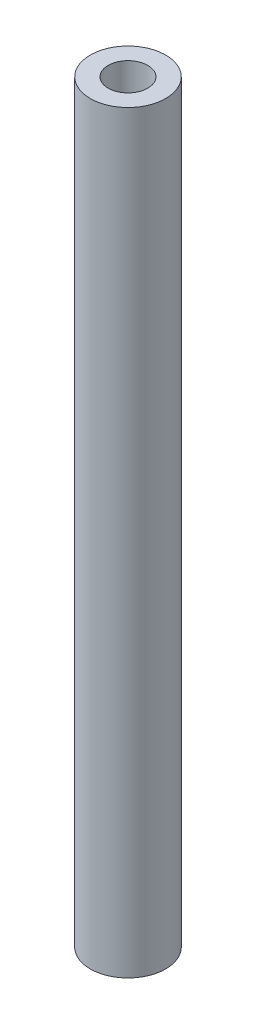
ISO-10303-21;
HEADER;
FILE_DESCRIPTION(('STEP AP214'),'2;1');
FILE_NAME('part.step','',(''),(''),'','','');
FILE_SCHEMA(('AUTOMOTIVE_DESIGN { 1 0 10303 214 1 1 1 1 }'));
ENDSEC;
DATA;
#1=APPLICATION_CONTEXT('core data for automotive mechanical design processes');
#2=APPLICATION_PROTOCOL_DEFINITION('international standard','automotive_design',2000,#1);
#3=PRODUCT_CONTEXT('',#1,'mechanical');
#4=PRODUCT('Part','Part','',(#3));
#5=PRODUCT_RELATED_PRODUCT_CATEGORY('part','',(#4));
#6=PRODUCT_DEFINITION_FORMATION('','',#4);
#7=PRODUCT_DEFINITION_CONTEXT('part definition',#1,'design');
#8=PRODUCT_DEFINITION('design','',#6,#7);
#9=PRODUCT_DEFINITION_SHAPE('','',#8);
#10=(LENGTH_UNIT() NAMED_UNIT(*) SI_UNIT(.MILLI.,.METRE.));
#11=(NAMED_UNIT(*) PLANE_ANGLE_UNIT() SI_UNIT($,.RADIAN.));
#12=(NAMED_UNIT(*) SI_UNIT($,.STERADIAN.) SOLID_ANGLE_UNIT());
#13=UNCERTAINTY_MEASURE_WITH_UNIT(LENGTH_MEASURE(1.E-05),#10,'distance_accuracy_value','');
#14=(GEOMETRIC_REPRESENTATION_CONTEXT(3) GLOBAL_UNCERTAINTY_ASSIGNED_CONTEXT((#13)) GLOBAL_UNIT_ASSIGNED_CONTEXT((#10,
#11,#12)) REPRESENTATION_CONTEXT('',''));
#15=CARTESIAN_POINT('',(0.,0.,0.));
#16=DIRECTION('',(0.,0.,1.));
#17=DIRECTION('',(1.,0.,0.));
#18=AXIS2_PLACEMENT_3D('',#15,#16,#17);
#19=CARTESIAN_POINT('',(0.,-0.0001,0.));
#20=DIRECTION('',(0.,1.,0.));
#21=DIRECTION('',(0.,0.,1.));
#22=AXIS2_PLACEMENT_3D('',#19,#20,#21);
#23=CYLINDRICAL_SURFACE('',#22,4.);
#24=CARTESIAN_POINT('',(0.,-0.0001,0.));
#25=DIRECTION('',(0.,1.,0.));
#26=DIRECTION('',(0.,0.,1.));
#27=AXIS2_PLACEMENT_3D('',#24,#25,#26);
#28=CIRCLE('',#27,4.);
#29=CARTESIAN_POINT('',(0.,-0.0001,4.));
#30=VERTEX_POINT('',#29);
#31=EDGE_CURVE('E11',#30,#30,#28,.T.);
#32=ORIENTED_EDGE('',*,*,#31,.T.);
#33=EDGE_LOOP('',(#32));
#34=FACE_BOUND('',#33,.T.);
#35=CARTESIAN_POINT('',(0.,80.,0.));
#36=DIRECTION('',(0.,1.,0.));
#37=DIRECTION('',(0.,0.,1.));
#38=AXIS2_PLACEMENT_3D('',#35,#36,#37);
#39=CIRCLE('',#38,4.);
#40=CARTESIAN_POINT('',(0.,80.,4.));
#41=VERTEX_POINT('',#40);
#42=EDGE_CURVE('E45',#41,#41,#39,.T.);
#43=ORIENTED_EDGE('',*,*,#42,.F.);
#44=EDGE_LOOP('',(#43));
#45=FACE_BOUND('',#44,.T.);
#46=ADVANCED_FACE('F38',(#34,#45),#23,.T.);
#47=CARTESIAN_POINT('',(0.,-0.0001,0.));
#48=DIRECTION('',(0.,1.,0.));
#49=DIRECTION('',(0.,0.,1.));
#50=AXIS2_PLACEMENT_3D('',#47,#48,#49);
#51=PLANE('',#50);
#52=CARTESIAN_POINT('',(0.,-9.99999999999449E-05,0.));
#53=DIRECTION('',(0.,-1.,0.));
#54=DIRECTION('',(0.,0.,-1.));
#55=AXIS2_PLACEMENT_3D('',#52,#53,#54);
#56=CIRCLE('',#55,2.1);
#57=CARTESIAN_POINT('',(0.,-9.99999999999449E-05,-2.1));
#58=VERTEX_POINT('',#57);
#59=EDGE_CURVE('E62',#58,#58,#56,.T.);
#60=ORIENTED_EDGE('',*,*,#59,.F.);
#61=EDGE_LOOP('',(#60));
#62=FACE_BOUND('',#61,.T.);
#63=ORIENTED_EDGE('',*,*,#31,.F.);
#64=EDGE_LOOP('',(#63));
#65=FACE_BOUND('',#64,.T.);
#66=ADVANCED_FACE('F77',(#62,#65),#51,.F.);
#67=CARTESIAN_POINT('',(0.,80.,0.));
#68=DIRECTION('',(0.,1.,0.));
#69=DIRECTION('',(0.,0.,1.));
#70=AXIS2_PLACEMENT_3D('',#67,#68,#69);
#71=PLANE('',#70);
#72=CARTESIAN_POINT('',(0.,80.,0.));
#73=DIRECTION('',(0.,1.,0.));
#74=DIRECTION('',(0.,0.,1.));
#75=AXIS2_PLACEMENT_3D('',#72,#73,#74);
#76=CIRCLE('',#75,2.1);
#77=CARTESIAN_POINT('',(0.,80.,2.1));
#78=VERTEX_POINT('',#77);
#79=EDGE_CURVE('E61',#78,#78,#76,.T.);
#80=ORIENTED_EDGE('',*,*,#79,.F.);
#81=EDGE_LOOP('',(#80));
#82=FACE_BOUND('',#81,.T.);
#83=ORIENTED_EDGE('',*,*,#42,.T.);
#84=EDGE_LOOP('',(#83));
#85=FACE_BOUND('',#84,.T.);
#86=ADVANCED_FACE('F74',(#82,#85),#71,.T.);
#87=CARTESIAN_POINT('',(0.,66.,0.));
#88=DIRECTION('',(0.,1.,0.));
#89=DIRECTION('',(0.,0.,1.));
#90=AXIS2_PLACEMENT_3D('',#87,#88,#89);
#91=CONICAL_SURFACE('',#90,2.1,1.02974425867665);
#92=CARTESIAN_POINT('',(0.,64.7381927000421,0.));
#93=VERTEX_POINT('',#92);
#94=VERTEX_LOOP('',#93);
#95=FACE_BOUND('',#94,.T.);
#96=CARTESIAN_POINT('',(0.,66.,0.));
#97=DIRECTION('',(0.,1.,0.));
#98=DIRECTION('',(0.,0.,1.));
#99=AXIS2_PLACEMENT_3D('',#96,#97,#98);
#100=CIRCLE('',#99,2.1);
#101=CARTESIAN_POINT('',(0.,66.,2.1));
#102=VERTEX_POINT('',#101);
#103=EDGE_CURVE('E65',#102,#102,#100,.T.);
#104=ORIENTED_EDGE('',*,*,#103,.T.);
#105=EDGE_LOOP('',(#104));
#106=FACE_BOUND('',#105,.T.);
#107=ADVANCED_FACE('F88',(#95,#106),#91,.F.);
#108=CARTESIAN_POINT('',(0.,80.,0.));
#109=DIRECTION('',(0.,1.,0.));
#110=DIRECTION('',(0.,0.,1.));
#111=AXIS2_PLACEMENT_3D('',#108,#109,#110);
#112=CYLINDRICAL_SURFACE('',#111,2.1);
#113=ORIENTED_EDGE('',*,*,#103,.F.);
#114=EDGE_LOOP('',(#113));
#115=FACE_BOUND('',#114,.T.);
#116=ORIENTED_EDGE('',*,*,#79,.T.);
#117=EDGE_LOOP('',(#116));
#118=FACE_BOUND('',#117,.T.);
#119=ADVANCED_FACE('F55',(#115,#118),#112,.F.);
#120=CARTESIAN_POINT('',(0.,13.9999,0.));
#121=DIRECTION('',(0.,-1.,0.));
#122=DIRECTION('',(0.,0.,-1.));
#123=AXIS2_PLACEMENT_3D('',#120,#121,#122);
#124=CONICAL_SURFACE('',#123,2.1,1.02974425867665);
#125=CARTESIAN_POINT('',(0.,15.2617072999579,0.));
#126=VERTEX_POINT('',#125);
#127=VERTEX_LOOP('',#126);
#128=FACE_BOUND('',#127,.T.);
#129=CARTESIAN_POINT('',(0.,13.9999,0.));
#130=DIRECTION('',(0.,-1.,0.));
#131=DIRECTION('',(0.,0.,-1.));
#132=AXIS2_PLACEMENT_3D('',#129,#130,#131);
#133=CIRCLE('',#132,2.1);
#134=CARTESIAN_POINT('',(0.,13.9999,-2.1));
#135=VERTEX_POINT('',#134);
#136=EDGE_CURVE('E59',#135,#135,#133,.T.);
#137=ORIENTED_EDGE('',*,*,#136,.T.);
#138=EDGE_LOOP('',(#137));
#139=FACE_BOUND('',#138,.T.);
#140=ADVANCED_FACE('F51',(#128,#139),#124,.F.);
#141=CARTESIAN_POINT('',(0.,-0.0001,0.));
#142=DIRECTION('',(0.,-1.,0.));
#143=DIRECTION('',(0.,0.,-1.));
#144=AXIS2_PLACEMENT_3D('',#141,#142,#143);
#145=CYLINDRICAL_SURFACE('',#144,2.1);
#146=ORIENTED_EDGE('',*,*,#136,.F.);
#147=EDGE_LOOP('',(#146));
#148=FACE_BOUND('',#147,.T.);
#149=ORIENTED_EDGE('',*,*,#59,.T.);
#150=EDGE_LOOP('',(#149));
#151=FACE_BOUND('',#150,.T.);
#152=ADVANCED_FACE('F54',(#148,#151),#145,.F.);
#153=CLOSED_SHELL('',(#46,#66,#86,#107,#119,#140,#152));
#154=MANIFOLD_SOLID_BREP('B2',#153);
#155=ADVANCED_BREP_SHAPE_REPRESENTATION('',(#18,#154),#14);
#156=SHAPE_DEFINITION_REPRESENTATION(#9,#155);
ENDSEC;
END-ISO-10303-21;
